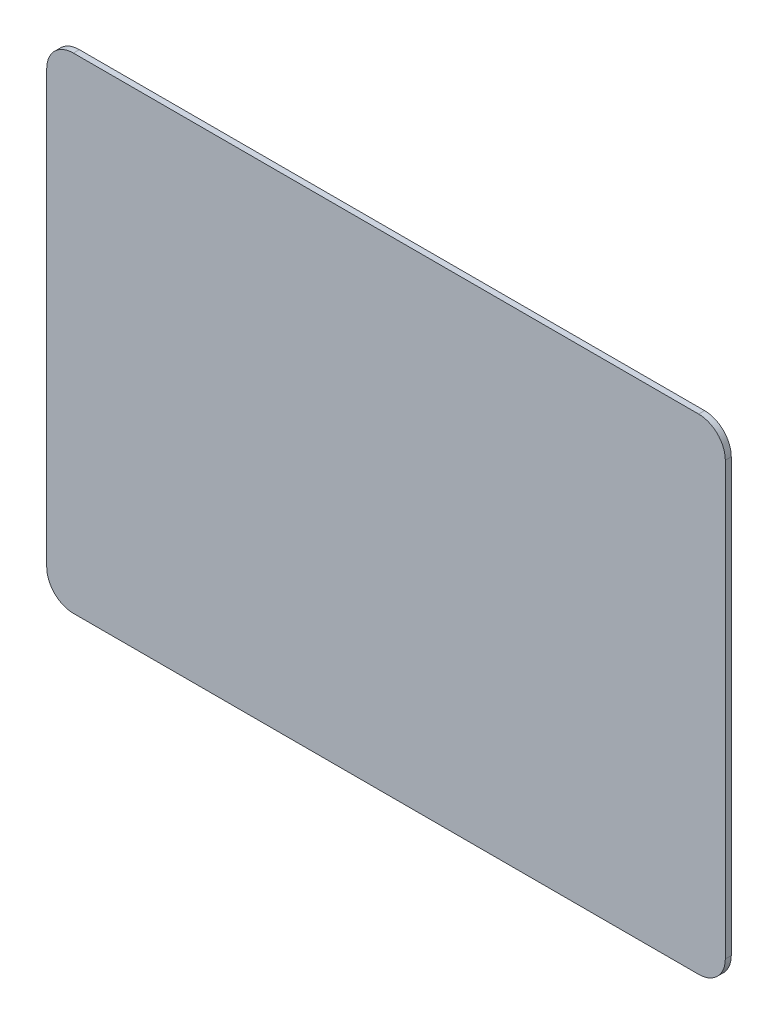
ISO-10303-21;
HEADER;
FILE_DESCRIPTION(('STEP AP214'),'2;1');
FILE_NAME('part.step','',(''),(''),'','','');
FILE_SCHEMA(('AUTOMOTIVE_DESIGN { 1 0 10303 214 1 1 1 1 }'));
ENDSEC;
DATA;
#1=APPLICATION_CONTEXT('core data for automotive mechanical design processes');
#2=APPLICATION_PROTOCOL_DEFINITION('international standard','automotive_design',2000,#1);
#3=PRODUCT_CONTEXT('',#1,'mechanical');
#4=PRODUCT('Part','Part','',(#3));
#5=PRODUCT_RELATED_PRODUCT_CATEGORY('part','',(#4));
#6=PRODUCT_DEFINITION_FORMATION('','',#4);
#7=PRODUCT_DEFINITION_CONTEXT('part definition',#1,'design');
#8=PRODUCT_DEFINITION('design','',#6,#7);
#9=PRODUCT_DEFINITION_SHAPE('','',#8);
#10=(LENGTH_UNIT() NAMED_UNIT(*) SI_UNIT(.MILLI.,.METRE.));
#11=(NAMED_UNIT(*) PLANE_ANGLE_UNIT() SI_UNIT($,.RADIAN.));
#12=(NAMED_UNIT(*) SI_UNIT($,.STERADIAN.) SOLID_ANGLE_UNIT());
#13=UNCERTAINTY_MEASURE_WITH_UNIT(LENGTH_MEASURE(1.E-05),#10,'distance_accuracy_value','');
#14=(GEOMETRIC_REPRESENTATION_CONTEXT(3) GLOBAL_UNCERTAINTY_ASSIGNED_CONTEXT((#13)) GLOBAL_UNIT_ASSIGNED_CONTEXT((#10,
#11,#12)) REPRESENTATION_CONTEXT('',''));
#15=CARTESIAN_POINT('',(0.,0.,0.));
#16=DIRECTION('',(0.,0.,1.));
#17=DIRECTION('',(1.,0.,0.));
#18=AXIS2_PLACEMENT_3D('',#15,#16,#17);
#19=CARTESIAN_POINT('',(-41.4059441680608,33.2322162383544,-3.175));
#20=DIRECTION('',(0.,0.,1.));
#21=DIRECTION('',(1.,0.,0.));
#22=AXIS2_PLACEMENT_3D('',#19,#20,#21);
#23=CYLINDRICAL_SURFACE('',#22,14.224);
#24=CARTESIAN_POINT('',(-41.4059441680608,33.2322162383544,0.));
#25=DIRECTION('',(0.,0.,1.));
#26=DIRECTION('',(1.,0.,0.));
#27=AXIS2_PLACEMENT_3D('',#24,#25,#26);
#28=CIRCLE('',#27,14.224);
#29=CARTESIAN_POINT('',(-41.4059441680608,47.4562162383544,0.));
#30=VERTEX_POINT('',#29);
#31=CARTESIAN_POINT('',(-55.6299441680608,33.2322162383544,0.));
#32=VERTEX_POINT('',#31);
#33=EDGE_CURVE('E130',#30,#32,#28,.T.);
#34=ORIENTED_EDGE('',*,*,#33,.F.);
#35=DIRECTION('',(0.,0.,1.));
#36=VECTOR('',#35,1.);
#37=CARTESIAN_POINT('',(-41.4059441680608,47.4562162383544,-3.175));
#38=LINE('',#37,#36);
#39=CARTESIAN_POINT('',(-41.4059441680608,47.4562162383544,-3.175));
#40=VERTEX_POINT('',#39);
#41=EDGE_CURVE('E11',#40,#30,#38,.T.);
#42=ORIENTED_EDGE('',*,*,#41,.F.);
#43=CARTESIAN_POINT('',(-41.4059441680608,33.2322162383544,-3.175));
#44=DIRECTION('',(0.,0.,1.));
#45=DIRECTION('',(1.,0.,0.));
#46=AXIS2_PLACEMENT_3D('',#43,#44,#45);
#47=CIRCLE('',#46,14.224);
#48=CARTESIAN_POINT('',(-55.6299441680608,33.2322162383544,-3.175));
#49=VERTEX_POINT('',#48);
#50=EDGE_CURVE('E150',#40,#49,#47,.T.);
#51=ORIENTED_EDGE('',*,*,#50,.T.);
#52=DIRECTION('',(0.,0.,1.));
#53=VECTOR('',#52,1.);
#54=CARTESIAN_POINT('',(-55.6299441680608,33.2322162383544,-3.175));
#55=LINE('',#54,#53);
#56=EDGE_CURVE('E36',#49,#32,#55,.T.);
#57=ORIENTED_EDGE('',*,*,#56,.T.);
#58=EDGE_LOOP('',(#34,#42,#51,#57));
#59=FACE_BOUND('',#58,.T.);
#60=ADVANCED_FACE('F33',(#59),#23,.T.);
#61=CARTESIAN_POINT('',(-41.4059441680608,47.4562162383544,-3.175));
#62=DIRECTION('',(0.,1.,0.));
#63=DIRECTION('',(-1.,0.,0.));
#64=AXIS2_PLACEMENT_3D('',#61,#62,#63);
#65=PLANE('',#64);
#66=DIRECTION('',(-1.,0.,0.));
#67=VECTOR('',#66,1.);
#68=CARTESIAN_POINT('',(-41.4059441680608,47.4562162383544,0.));
#69=LINE('',#68,#67);
#70=CARTESIAN_POINT('',(292.096055831939,47.4562162383544,0.));
#71=VERTEX_POINT('',#70);
#72=EDGE_CURVE('E148',#71,#30,#69,.T.);
#73=ORIENTED_EDGE('',*,*,#72,.F.);
#74=DIRECTION('',(0.,0.,1.));
#75=VECTOR('',#74,1.);
#76=CARTESIAN_POINT('',(292.096055831939,47.4562162383544,-3.175));
#77=LINE('',#76,#75);
#78=CARTESIAN_POINT('',(292.096055831939,47.4562162383544,-3.175));
#79=VERTEX_POINT('',#78);
#80=EDGE_CURVE('E42',#79,#71,#77,.T.);
#81=ORIENTED_EDGE('',*,*,#80,.F.);
#82=DIRECTION('',(-1.,0.,0.));
#83=VECTOR('',#82,1.);
#84=CARTESIAN_POINT('',(-41.4059441680608,47.4562162383544,-3.175));
#85=LINE('',#84,#83);
#86=EDGE_CURVE('E120',#79,#40,#85,.T.);
#87=ORIENTED_EDGE('',*,*,#86,.T.);
#88=ORIENTED_EDGE('',*,*,#41,.T.);
#89=EDGE_LOOP('',(#73,#81,#87,#88));
#90=FACE_BOUND('',#89,.T.);
#91=ADVANCED_FACE('F162',(#90),#65,.T.);
#92=CARTESIAN_POINT('',(292.096055831939,33.2322162383544,-3.175));
#93=DIRECTION('',(0.,0.,1.));
#94=DIRECTION('',(1.,0.,0.));
#95=AXIS2_PLACEMENT_3D('',#92,#93,#94);
#96=CYLINDRICAL_SURFACE('',#95,14.224);
#97=CARTESIAN_POINT('',(292.096055831939,33.2322162383544,0.));
#98=DIRECTION('',(0.,0.,1.));
#99=DIRECTION('',(1.,0.,0.));
#100=AXIS2_PLACEMENT_3D('',#97,#98,#99);
#101=CIRCLE('',#100,14.224);
#102=CARTESIAN_POINT('',(306.320055831939,33.2322162383544,0.));
#103=VERTEX_POINT('',#102);
#104=EDGE_CURVE('E107',#103,#71,#101,.T.);
#105=ORIENTED_EDGE('',*,*,#104,.F.);
#106=DIRECTION('',(0.,0.,1.));
#107=VECTOR('',#106,1.);
#108=CARTESIAN_POINT('',(306.320055831939,33.2322162383544,-3.175));
#109=LINE('',#108,#107);
#110=CARTESIAN_POINT('',(306.320055831939,33.2322162383544,-3.175));
#111=VERTEX_POINT('',#110);
#112=EDGE_CURVE('E102',#111,#103,#109,.T.);
#113=ORIENTED_EDGE('',*,*,#112,.F.);
#114=CARTESIAN_POINT('',(292.096055831939,33.2322162383544,-3.175));
#115=DIRECTION('',(0.,0.,1.));
#116=DIRECTION('',(1.,0.,0.));
#117=AXIS2_PLACEMENT_3D('',#114,#115,#116);
#118=CIRCLE('',#117,14.224);
#119=EDGE_CURVE('E105',#111,#79,#118,.T.);
#120=ORIENTED_EDGE('',*,*,#119,.T.);
#121=ORIENTED_EDGE('',*,*,#80,.T.);
#122=EDGE_LOOP('',(#105,#113,#120,#121));
#123=FACE_BOUND('',#122,.T.);
#124=ADVANCED_FACE('F104',(#123),#96,.T.);
#125=CARTESIAN_POINT('',(306.320055831939,33.2322162383544,-3.175));
#126=DIRECTION('',(1.,0.,0.));
#127=DIRECTION('',(0.,1.,0.));
#128=AXIS2_PLACEMENT_3D('',#125,#126,#127);
#129=PLANE('',#128);
#130=DIRECTION('',(0.,1.,0.));
#131=VECTOR('',#130,1.);
#132=CARTESIAN_POINT('',(306.320055831939,33.2322162383544,0.));
#133=LINE('',#132,#131);
#134=CARTESIAN_POINT('',(306.320055831939,-197.145783761646,0.));
#135=VERTEX_POINT('',#134);
#136=EDGE_CURVE('E145',#135,#103,#133,.T.);
#137=ORIENTED_EDGE('',*,*,#136,.F.);
#138=DIRECTION('',(0.,0.,1.));
#139=VECTOR('',#138,1.);
#140=CARTESIAN_POINT('',(306.320055831939,-197.145783761646,-3.175));
#141=LINE('',#140,#139);
#142=CARTESIAN_POINT('',(306.320055831939,-197.145783761646,-3.175));
#143=VERTEX_POINT('',#142);
#144=EDGE_CURVE('E112',#143,#135,#141,.T.);
#145=ORIENTED_EDGE('',*,*,#144,.F.);
#146=DIRECTION('',(0.,1.,0.));
#147=VECTOR('',#146,1.);
#148=CARTESIAN_POINT('',(306.320055831939,33.2322162383544,-3.175));
#149=LINE('',#148,#147);
#150=EDGE_CURVE('E118',#143,#111,#149,.T.);
#151=ORIENTED_EDGE('',*,*,#150,.T.);
#152=ORIENTED_EDGE('',*,*,#112,.T.);
#153=EDGE_LOOP('',(#137,#145,#151,#152));
#154=FACE_BOUND('',#153,.T.);
#155=ADVANCED_FACE('F122',(#154),#129,.T.);
#156=CARTESIAN_POINT('',(292.096055831939,-197.145783761646,-3.175));
#157=DIRECTION('',(0.,0.,1.));
#158=DIRECTION('',(1.,0.,0.));
#159=AXIS2_PLACEMENT_3D('',#156,#157,#158);
#160=CYLINDRICAL_SURFACE('',#159,14.224);
#161=CARTESIAN_POINT('',(292.096055831939,-197.145783761646,0.));
#162=DIRECTION('',(0.,0.,1.));
#163=DIRECTION('',(1.,0.,0.));
#164=AXIS2_PLACEMENT_3D('',#161,#162,#163);
#165=CIRCLE('',#164,14.224);
#166=CARTESIAN_POINT('',(292.096055831939,-211.369783761646,0.));
#167=VERTEX_POINT('',#166);
#168=EDGE_CURVE('E142',#167,#135,#165,.T.);
#169=ORIENTED_EDGE('',*,*,#168,.F.);
#170=DIRECTION('',(0.,0.,1.));
#171=VECTOR('',#170,1.);
#172=CARTESIAN_POINT('',(292.096055831939,-211.369783761646,-3.175));
#173=LINE('',#172,#171);
#174=CARTESIAN_POINT('',(292.096055831939,-211.369783761646,-3.175));
#175=VERTEX_POINT('',#174);
#176=EDGE_CURVE('E154',#175,#167,#173,.T.);
#177=ORIENTED_EDGE('',*,*,#176,.F.);
#178=CARTESIAN_POINT('',(292.096055831939,-197.145783761646,-3.175));
#179=DIRECTION('',(0.,0.,1.));
#180=DIRECTION('',(1.,0.,0.));
#181=AXIS2_PLACEMENT_3D('',#178,#179,#180);
#182=CIRCLE('',#181,14.224);
#183=EDGE_CURVE('E123',#175,#143,#182,.T.);
#184=ORIENTED_EDGE('',*,*,#183,.T.);
#185=ORIENTED_EDGE('',*,*,#144,.T.);
#186=EDGE_LOOP('',(#169,#177,#184,#185));
#187=FACE_BOUND('',#186,.T.);
#188=ADVANCED_FACE('F175',(#187),#160,.T.);
#189=CARTESIAN_POINT('',(-41.4059441680606,-211.369783761646,-3.175));
#190=DIRECTION('',(0.,-1.,0.));
#191=DIRECTION('',(0.,0.,-1.));
#192=AXIS2_PLACEMENT_3D('',#189,#190,#191);
#193=PLANE('',#192);
#194=DIRECTION('',(1.,0.,0.));
#195=VECTOR('',#194,1.);
#196=CARTESIAN_POINT('',(-41.4059441680606,-211.369783761646,0.));
#197=LINE('',#196,#195);
#198=CARTESIAN_POINT('',(-41.4059441680606,-211.369783761646,0.));
#199=VERTEX_POINT('',#198);
#200=EDGE_CURVE('E139',#199,#167,#197,.T.);
#201=ORIENTED_EDGE('',*,*,#200,.F.);
#202=DIRECTION('',(0.,0.,1.));
#203=VECTOR('',#202,1.);
#204=CARTESIAN_POINT('',(-41.4059441680606,-211.369783761646,-3.175));
#205=LINE('',#204,#203);
#206=CARTESIAN_POINT('',(-41.4059441680606,-211.369783761646,-3.175));
#207=VERTEX_POINT('',#206);
#208=EDGE_CURVE('E156',#207,#199,#205,.T.);
#209=ORIENTED_EDGE('',*,*,#208,.F.);
#210=DIRECTION('',(1.,0.,0.));
#211=VECTOR('',#210,1.);
#212=CARTESIAN_POINT('',(-41.4059441680606,-211.369783761646,-3.175));
#213=LINE('',#212,#211);
#214=EDGE_CURVE('E125',#207,#175,#213,.T.);
#215=ORIENTED_EDGE('',*,*,#214,.T.);
#216=ORIENTED_EDGE('',*,*,#176,.T.);
#217=EDGE_LOOP('',(#201,#209,#215,#216));
#218=FACE_BOUND('',#217,.T.);
#219=ADVANCED_FACE('F178',(#218),#193,.T.);
#220=CARTESIAN_POINT('',(-41.4059441680607,-197.145783761646,-3.175));
#221=DIRECTION('',(0.,0.,1.));
#222=DIRECTION('',(1.,0.,0.));
#223=AXIS2_PLACEMENT_3D('',#220,#221,#222);
#224=CYLINDRICAL_SURFACE('',#223,14.224);
#225=CARTESIAN_POINT('',(-41.4059441680607,-197.145783761646,0.));
#226=DIRECTION('',(0.,0.,1.));
#227=DIRECTION('',(1.,0.,0.));
#228=AXIS2_PLACEMENT_3D('',#225,#226,#227);
#229=CIRCLE('',#228,14.224);
#230=CARTESIAN_POINT('',(-55.6299441680607,-197.145783761645,0.));
#231=VERTEX_POINT('',#230);
#232=EDGE_CURVE('E136',#231,#199,#229,.T.);
#233=ORIENTED_EDGE('',*,*,#232,.F.);
#234=DIRECTION('',(0.,0.,1.));
#235=VECTOR('',#234,1.);
#236=CARTESIAN_POINT('',(-55.6299441680607,-197.145783761645,-3.175));
#237=LINE('',#236,#235);
#238=CARTESIAN_POINT('',(-55.6299441680607,-197.145783761645,-3.175));
#239=VERTEX_POINT('',#238);
#240=EDGE_CURVE('E157',#239,#231,#237,.T.);
#241=ORIENTED_EDGE('',*,*,#240,.F.);
#242=CARTESIAN_POINT('',(-41.4059441680607,-197.145783761646,-3.175));
#243=DIRECTION('',(0.,0.,1.));
#244=DIRECTION('',(1.,0.,0.));
#245=AXIS2_PLACEMENT_3D('',#242,#243,#244);
#246=CIRCLE('',#245,14.224);
#247=EDGE_CURVE('E253',#239,#207,#246,.T.);
#248=ORIENTED_EDGE('',*,*,#247,.T.);
#249=ORIENTED_EDGE('',*,*,#208,.T.);
#250=EDGE_LOOP('',(#233,#241,#248,#249));
#251=FACE_BOUND('',#250,.T.);
#252=ADVANCED_FACE('F182',(#251),#224,.T.);
#253=CARTESIAN_POINT('',(-55.6299441680608,33.2322162383544,-3.175));
#254=DIRECTION('',(-1.,0.,0.));
#255=DIRECTION('',(0.,-1.,0.));
#256=AXIS2_PLACEMENT_3D('',#253,#254,#255);
#257=PLANE('',#256);
#258=DIRECTION('',(0.,-1.,0.));
#259=VECTOR('',#258,1.);
#260=CARTESIAN_POINT('',(-55.6299441680608,33.2322162383544,0.));
#261=LINE('',#260,#259);
#262=EDGE_CURVE('E133',#32,#231,#261,.T.);
#263=ORIENTED_EDGE('',*,*,#262,.F.);
#264=ORIENTED_EDGE('',*,*,#56,.F.);
#265=DIRECTION('',(0.,-1.,0.));
#266=VECTOR('',#265,1.);
#267=CARTESIAN_POINT('',(-55.6299441680608,33.2322162383544,-3.175));
#268=LINE('',#267,#266);
#269=EDGE_CURVE('E254',#49,#239,#268,.T.);
#270=ORIENTED_EDGE('',*,*,#269,.T.);
#271=ORIENTED_EDGE('',*,*,#240,.T.);
#272=EDGE_LOOP('',(#263,#264,#270,#271));
#273=FACE_BOUND('',#272,.T.);
#274=ADVANCED_FACE('F159',(#273),#257,.T.);
#275=CARTESIAN_POINT('',(-41.4059441680608,33.2322162383544,-3.175));
#276=DIRECTION('',(0.,0.,1.));
#277=DIRECTION('',(1.,0.,0.));
#278=AXIS2_PLACEMENT_3D('',#275,#276,#277);
#279=PLANE('',#278);
#280=ORIENTED_EDGE('',*,*,#50,.F.);
#281=ORIENTED_EDGE('',*,*,#86,.F.);
#282=ORIENTED_EDGE('',*,*,#119,.F.);
#283=ORIENTED_EDGE('',*,*,#150,.F.);
#284=ORIENTED_EDGE('',*,*,#183,.F.);
#285=ORIENTED_EDGE('',*,*,#214,.F.);
#286=ORIENTED_EDGE('',*,*,#247,.F.);
#287=ORIENTED_EDGE('',*,*,#269,.F.);
#288=EDGE_LOOP('',(#280,#281,#282,#283,#284,#285,#286,#287));
#289=FACE_BOUND('',#288,.T.);
#290=ADVANCED_FACE('F116',(#289),#279,.F.);
#291=CARTESIAN_POINT('',(-41.4059441680608,33.2322162383544,0.));
#292=DIRECTION('',(0.,0.,1.));
#293=DIRECTION('',(1.,0.,0.));
#294=AXIS2_PLACEMENT_3D('',#291,#292,#293);
#295=PLANE('',#294);
#296=ORIENTED_EDGE('',*,*,#33,.T.);
#297=ORIENTED_EDGE('',*,*,#262,.T.);
#298=ORIENTED_EDGE('',*,*,#232,.T.);
#299=ORIENTED_EDGE('',*,*,#200,.T.);
#300=ORIENTED_EDGE('',*,*,#168,.T.);
#301=ORIENTED_EDGE('',*,*,#136,.T.);
#302=ORIENTED_EDGE('',*,*,#104,.T.);
#303=ORIENTED_EDGE('',*,*,#72,.T.);
#304=EDGE_LOOP('',(#296,#297,#298,#299,#300,#301,#302,#303));
#305=FACE_BOUND('',#304,.T.);
#306=ADVANCED_FACE('F161',(#305),#295,.T.);
#307=CLOSED_SHELL('',(#60,#91,#124,#155,#188,#219,#252,#274,#290,#306));
#308=MANIFOLD_SOLID_BREP('B2',#307);
#309=ADVANCED_BREP_SHAPE_REPRESENTATION('',(#18,#308),#14);
#310=SHAPE_DEFINITION_REPRESENTATION(#9,#309);
ENDSEC;
END-ISO-10303-21;
